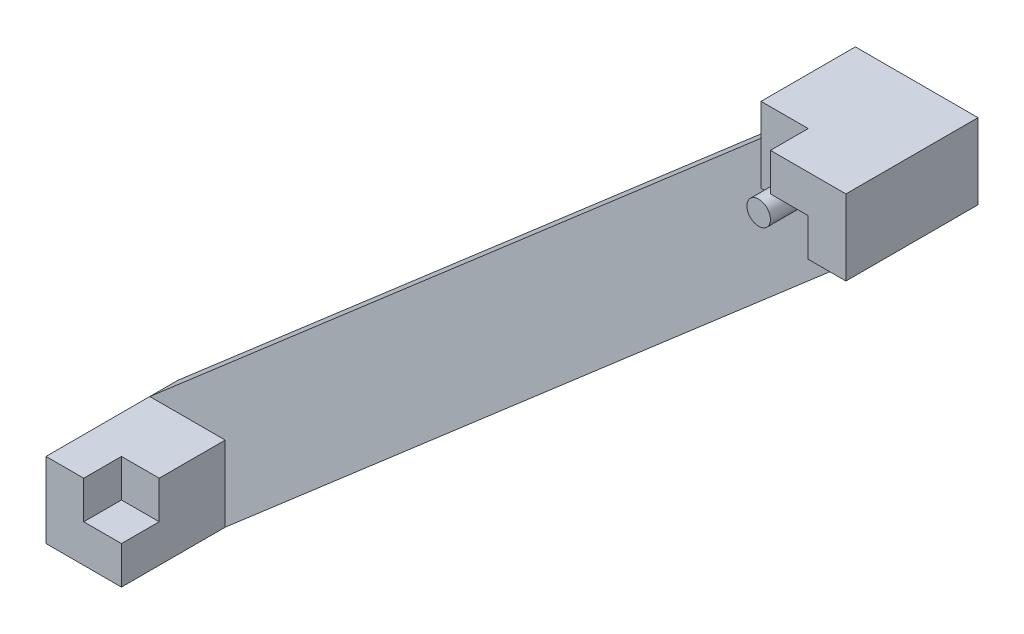
ISO-10303-21;
HEADER;
FILE_DESCRIPTION(('STEP AP214'),'2;1');
FILE_NAME('part.step','',(''),(''),'','','');
FILE_SCHEMA(('AUTOMOTIVE_DESIGN { 1 0 10303 214 1 1 1 1 }'));
ENDSEC;
DATA;
#1=APPLICATION_CONTEXT('core data for automotive mechanical design processes');
#2=APPLICATION_PROTOCOL_DEFINITION('international standard','automotive_design',2000,#1);
#3=PRODUCT_CONTEXT('',#1,'mechanical');
#4=PRODUCT('Part','Part','',(#3));
#5=PRODUCT_RELATED_PRODUCT_CATEGORY('part','',(#4));
#6=PRODUCT_DEFINITION_FORMATION('','',#4);
#7=PRODUCT_DEFINITION_CONTEXT('part definition',#1,'design');
#8=PRODUCT_DEFINITION('design','',#6,#7);
#9=PRODUCT_DEFINITION_SHAPE('','',#8);
#10=(LENGTH_UNIT() NAMED_UNIT(*) SI_UNIT(.MILLI.,.METRE.));
#11=(NAMED_UNIT(*) PLANE_ANGLE_UNIT() SI_UNIT($,.RADIAN.));
#12=(NAMED_UNIT(*) SI_UNIT($,.STERADIAN.) SOLID_ANGLE_UNIT());
#13=UNCERTAINTY_MEASURE_WITH_UNIT(LENGTH_MEASURE(1.E-05),#10,'distance_accuracy_value','');
#14=(GEOMETRIC_REPRESENTATION_CONTEXT(3) GLOBAL_UNCERTAINTY_ASSIGNED_CONTEXT((#13)) GLOBAL_UNIT_ASSIGNED_CONTEXT((#10,
#11,#12)) REPRESENTATION_CONTEXT('',''));
#15=CARTESIAN_POINT('',(0.,0.,0.));
#16=DIRECTION('',(0.,0.,1.));
#17=DIRECTION('',(1.,0.,0.));
#18=AXIS2_PLACEMENT_3D('',#15,#16,#17);
#19=CARTESIAN_POINT('',(71.55,64.15,4.));
#20=DIRECTION('',(0.,0.,-1.));
#21=DIRECTION('',(-1.,0.,0.));
#22=AXIS2_PLACEMENT_3D('',#19,#20,#21);
#23=CYLINDRICAL_SURFACE('',#22,1.25);
#24=CARTESIAN_POINT('',(71.55,64.15,4.));
#25=DIRECTION('',(0.,0.,1.));
#26=DIRECTION('',(1.,0.,0.));
#27=AXIS2_PLACEMENT_3D('',#24,#25,#26);
#28=CIRCLE('',#27,1.25);
#29=CARTESIAN_POINT('',(72.8,64.15,4.));
#30=VERTEX_POINT('',#29);
#31=EDGE_CURVE('E11',#30,#30,#28,.T.);
#32=ORIENTED_EDGE('',*,*,#31,.F.);
#33=EDGE_LOOP('',(#32));
#34=FACE_BOUND('',#33,.T.);
#35=CARTESIAN_POINT('',(71.55,64.15,0.));
#36=DIRECTION('',(0.,0.,1.));
#37=DIRECTION('',(1.,0.,0.));
#38=AXIS2_PLACEMENT_3D('',#35,#36,#37);
#39=CIRCLE('',#38,1.25);
#40=CARTESIAN_POINT('',(72.8,64.15,0.));
#41=VERTEX_POINT('',#40);
#42=EDGE_CURVE('E50',#41,#41,#39,.T.);
#43=ORIENTED_EDGE('',*,*,#42,.T.);
#44=EDGE_LOOP('',(#43));
#45=FACE_BOUND('',#44,.T.);
#46=ADVANCED_FACE('F47',(#34,#45),#23,.T.);
#47=CARTESIAN_POINT('',(71.55,64.15,4.));
#48=DIRECTION('',(0.,0.,1.));
#49=DIRECTION('',(1.,0.,0.));
#50=AXIS2_PLACEMENT_3D('',#47,#48,#49);
#51=PLANE('',#50);
#52=ORIENTED_EDGE('',*,*,#31,.T.);
#53=EDGE_LOOP('',(#52));
#54=FACE_BOUND('',#53,.T.);
#55=ADVANCED_FACE('F62',(#54),#51,.T.);
#56=CARTESIAN_POINT('',(71.55,64.15,0.));
#57=DIRECTION('',(0.,0.,1.));
#58=DIRECTION('',(1.,0.,0.));
#59=AXIS2_PLACEMENT_3D('',#56,#57,#58);
#60=PLANE('',#59);
#61=ORIENTED_EDGE('',*,*,#42,.F.);
#62=EDGE_LOOP('',(#61));
#63=FACE_BOUND('',#62,.T.);
#64=ADVANCED_FACE('F60',(#63),#60,.F.);
#65=CLOSED_SHELL('',(#46,#55,#64));
#66=MANIFOLD_SOLID_BREP('B2',#65);
#67=CARTESIAN_POINT('',(0.,0.,-7.));
#68=DIRECTION('',(0.,0.,-1.));
#69=DIRECTION('',(-1.,0.,0.));
#70=AXIS2_PLACEMENT_3D('',#67,#68,#69);
#71=PLANE('',#70);
#72=DIRECTION('',(-1.,0.,0.));
#73=VECTOR('',#72,1.);
#74=CARTESIAN_POINT('',(67.8,62.5,-7.));
#75=LINE('',#74,#73);
#76=CARTESIAN_POINT('',(80.8,62.5,-7.));
#77=VERTEX_POINT('',#76);
#78=CARTESIAN_POINT('',(67.8,62.5,-7.));
#79=VERTEX_POINT('',#78);
#80=EDGE_CURVE('E221',#77,#79,#75,.T.);
#81=ORIENTED_EDGE('',*,*,#80,.T.);
#82=DIRECTION('',(0.,1.,0.));
#83=VECTOR('',#82,1.);
#84=CARTESIAN_POINT('',(67.8,70.5,-7.));
#85=LINE('',#84,#83);
#86=CARTESIAN_POINT('',(67.8,66.1705729166667,-7.));
#87=VERTEX_POINT('',#86);
#88=EDGE_CURVE('E229',#79,#87,#85,.T.);
#89=ORIENTED_EDGE('',*,*,#88,.T.);
#90=DIRECTION('',(0.755981314702039,0.65459319567299,0.));
#91=VECTOR('',#90,1.);
#92=CARTESIAN_POINT('',(-4.,4.00000000000001,-7.));
#93=LINE('',#92,#91);
#94=CARTESIAN_POINT('',(-4.,4.00000000000001,-7.));
#95=VERTEX_POINT('',#94);
#96=EDGE_CURVE('E246',#95,#87,#93,.T.);
#97=ORIENTED_EDGE('',*,*,#96,.F.);
#98=DIRECTION('',(1.,0.,0.));
#99=VECTOR('',#98,1.);
#100=CARTESIAN_POINT('',(-4.,4.00000000000001,-7.));
#101=LINE('',#100,#99);
#102=CARTESIAN_POINT('',(4.00000000000001,4.00000000000001,-7.));
#103=VERTEX_POINT('',#102);
#104=EDGE_CURVE('E276',#95,#103,#101,.T.);
#105=ORIENTED_EDGE('',*,*,#104,.T.);
#106=DIRECTION('',(0.,-1.,0.));
#107=VECTOR('',#106,1.);
#108=CARTESIAN_POINT('',(4.00000000000001,-4.,-7.));
#109=LINE('',#108,#107);
#110=CARTESIAN_POINT('',(4.00000000000001,-4.,-7.));
#111=VERTEX_POINT('',#110);
#112=EDGE_CURVE('E245',#103,#111,#109,.T.);
#113=ORIENTED_EDGE('',*,*,#112,.T.);
#114=DIRECTION('',(-0.755981314702039,-0.65459319567299,0.));
#115=VECTOR('',#114,1.);
#116=CARTESIAN_POINT('',(4.00000000000001,-4.,-7.));
#117=LINE('',#116,#115);
#118=EDGE_CURVE('E236',#77,#111,#117,.T.);
#119=ORIENTED_EDGE('',*,*,#118,.F.);
#120=EDGE_LOOP('',(#81,#89,#97,#105,#113,#119));
#121=FACE_BOUND('',#120,.T.);
#122=ADVANCED_FACE('F88',(#121),#71,.F.);
#123=CARTESIAN_POINT('',(4.,0.,4.));
#124=DIRECTION('',(0.,-1.,0.));
#125=DIRECTION('',(0.,0.,-1.));
#126=AXIS2_PLACEMENT_3D('',#123,#124,#125);
#127=PLANE('',#126);
#128=DIRECTION('',(-1.,0.,0.));
#129=VECTOR('',#128,1.);
#130=CARTESIAN_POINT('',(4.,0.,0.));
#131=LINE('',#130,#129);
#132=CARTESIAN_POINT('',(4.00000000000001,0.,0.));
#133=VERTEX_POINT('',#132);
#134=CARTESIAN_POINT('',(0.,0.,0.));
#135=VERTEX_POINT('',#134);
#136=EDGE_CURVE('E278',#133,#135,#131,.T.);
#137=ORIENTED_EDGE('',*,*,#136,.T.);
#138=DIRECTION('',(0.,0.,-1.));
#139=VECTOR('',#138,1.);
#140=CARTESIAN_POINT('',(0.,0.,4.));
#141=LINE('',#140,#139);
#142=CARTESIAN_POINT('',(0.,0.,4.));
#143=VERTEX_POINT('',#142);
#144=EDGE_CURVE('E45',#143,#135,#141,.T.);
#145=ORIENTED_EDGE('',*,*,#144,.F.);
#146=DIRECTION('',(-1.,0.,0.));
#147=VECTOR('',#146,1.);
#148=CARTESIAN_POINT('',(4.,0.,4.));
#149=LINE('',#148,#147);
#150=CARTESIAN_POINT('',(4.,0.,4.));
#151=VERTEX_POINT('',#150);
#152=EDGE_CURVE('E281',#151,#143,#149,.T.);
#153=ORIENTED_EDGE('',*,*,#152,.F.);
#154=DIRECTION('',(0.,0.,-1.));
#155=VECTOR('',#154,1.);
#156=CARTESIAN_POINT('',(4.,0.,4.));
#157=LINE('',#156,#155);
#158=EDGE_CURVE('E293',#151,#133,#157,.T.);
#159=ORIENTED_EDGE('',*,*,#158,.T.);
#160=EDGE_LOOP('',(#137,#145,#153,#159));
#161=FACE_BOUND('',#160,.T.);
#162=ADVANCED_FACE('F90',(#161),#127,.F.);
#163=CARTESIAN_POINT('',(0.,0.,4.));
#164=DIRECTION('',(-1.,0.,0.));
#165=DIRECTION('',(0.,0.,1.));
#166=AXIS2_PLACEMENT_3D('',#163,#164,#165);
#167=PLANE('',#166);
#168=DIRECTION('',(0.,1.,0.));
#169=VECTOR('',#168,1.);
#170=CARTESIAN_POINT('',(0.,0.,0.));
#171=LINE('',#170,#169);
#172=CARTESIAN_POINT('',(0.,4.,0.));
#173=VERTEX_POINT('',#172);
#174=EDGE_CURVE('E284',#135,#173,#171,.T.);
#175=ORIENTED_EDGE('',*,*,#174,.T.);
#176=DIRECTION('',(0.,0.,-1.));
#177=VECTOR('',#176,1.);
#178=CARTESIAN_POINT('',(0.,4.,4.));
#179=LINE('',#178,#177);
#180=CARTESIAN_POINT('',(0.,4.,4.));
#181=VERTEX_POINT('',#180);
#182=EDGE_CURVE('E97',#181,#173,#179,.T.);
#183=ORIENTED_EDGE('',*,*,#182,.F.);
#184=DIRECTION('',(0.,1.,0.));
#185=VECTOR('',#184,1.);
#186=CARTESIAN_POINT('',(0.,0.,4.));
#187=LINE('',#186,#185);
#188=EDGE_CURVE('E283',#143,#181,#187,.T.);
#189=ORIENTED_EDGE('',*,*,#188,.F.);
#190=ORIENTED_EDGE('',*,*,#144,.T.);
#191=EDGE_LOOP('',(#175,#183,#189,#190));
#192=FACE_BOUND('',#191,.T.);
#193=ADVANCED_FACE('F313',(#192),#167,.F.);
#194=CARTESIAN_POINT('',(0.,4.,4.));
#195=DIRECTION('',(0.,-1.,0.));
#196=DIRECTION('',(1.,0.,0.));
#197=AXIS2_PLACEMENT_3D('',#194,#195,#196);
#198=PLANE('',#197);
#199=ORIENTED_EDGE('',*,*,#182,.T.);
#200=DIRECTION('',(1.,0.,0.));
#201=VECTOR('',#200,1.);
#202=CARTESIAN_POINT('',(-4.,4.00000000000001,0.));
#203=LINE('',#202,#201);
#204=CARTESIAN_POINT('',(4.00000000000001,4.00000000000001,0.));
#205=VERTEX_POINT('',#204);
#206=EDGE_CURVE('E275',#173,#205,#203,.T.);
#207=ORIENTED_EDGE('',*,*,#206,.T.);
#208=DIRECTION('',(0.,0.,1.));
#209=VECTOR('',#208,1.);
#210=CARTESIAN_POINT('',(4.00000000000001,4.00000000000001,-7.));
#211=LINE('',#210,#209);
#212=EDGE_CURVE('E269',#103,#205,#211,.T.);
#213=ORIENTED_EDGE('',*,*,#212,.F.);
#214=ORIENTED_EDGE('',*,*,#104,.F.);
#215=DIRECTION('',(0.,0.,-1.));
#216=VECTOR('',#215,1.);
#217=CARTESIAN_POINT('',(-4.,4.,4.));
#218=LINE('',#217,#216);
#219=CARTESIAN_POINT('',(-4.,4.,4.));
#220=VERTEX_POINT('',#219);
#221=EDGE_CURVE('E304',#220,#95,#218,.T.);
#222=ORIENTED_EDGE('',*,*,#221,.F.);
#223=DIRECTION('',(-1.,0.,0.));
#224=VECTOR('',#223,1.);
#225=CARTESIAN_POINT('',(0.,4.,4.));
#226=LINE('',#225,#224);
#227=EDGE_CURVE('E286',#181,#220,#226,.T.);
#228=ORIENTED_EDGE('',*,*,#227,.F.);
#229=EDGE_LOOP('',(#199,#207,#213,#214,#222,#228));
#230=FACE_BOUND('',#229,.T.);
#231=ADVANCED_FACE('F309',(#230),#198,.F.);
#232=CARTESIAN_POINT('',(-4.,4.,4.));
#233=DIRECTION('',(1.,0.,0.));
#234=DIRECTION('',(0.,1.,0.));
#235=AXIS2_PLACEMENT_3D('',#232,#233,#234);
#236=PLANE('',#235);
#237=ORIENTED_EDGE('',*,*,#221,.T.);
#238=DIRECTION('',(0.,0.,1.));
#239=VECTOR('',#238,1.);
#240=CARTESIAN_POINT('',(-4.,4.00000000000001,-10.));
#241=LINE('',#240,#239);
#242=CARTESIAN_POINT('',(-4.,4.00000000000001,-10.));
#243=VERTEX_POINT('',#242);
#244=EDGE_CURVE('E264',#243,#95,#241,.T.);
#245=ORIENTED_EDGE('',*,*,#244,.F.);
#246=DIRECTION('',(0.,1.,0.));
#247=VECTOR('',#246,1.);
#248=CARTESIAN_POINT('',(-4.,4.00000000000001,-10.));
#249=LINE('',#248,#247);
#250=CARTESIAN_POINT('',(-4.,-4.,-10.));
#251=VERTEX_POINT('',#250);
#252=EDGE_CURVE('E331',#251,#243,#249,.T.);
#253=ORIENTED_EDGE('',*,*,#252,.F.);
#254=DIRECTION('',(0.,0.,-1.));
#255=VECTOR('',#254,1.);
#256=CARTESIAN_POINT('',(-4.,-4.,4.));
#257=LINE('',#256,#255);
#258=CARTESIAN_POINT('',(-4.,-4.,4.));
#259=VERTEX_POINT('',#258);
#260=EDGE_CURVE('E302',#259,#251,#257,.T.);
#261=ORIENTED_EDGE('',*,*,#260,.F.);
#262=DIRECTION('',(0.,-1.,0.));
#263=VECTOR('',#262,1.);
#264=CARTESIAN_POINT('',(-4.,4.,4.));
#265=LINE('',#264,#263);
#266=EDGE_CURVE('E288',#220,#259,#265,.T.);
#267=ORIENTED_EDGE('',*,*,#266,.F.);
#268=EDGE_LOOP('',(#237,#245,#253,#261,#267));
#269=FACE_BOUND('',#268,.T.);
#270=ADVANCED_FACE('F328',(#269),#236,.F.);
#271=CARTESIAN_POINT('',(-4.,-4.,4.));
#272=DIRECTION('',(0.,1.,0.));
#273=DIRECTION('',(0.,0.,1.));
#274=AXIS2_PLACEMENT_3D('',#271,#272,#273);
#275=PLANE('',#274);
#276=ORIENTED_EDGE('',*,*,#260,.T.);
#277=DIRECTION('',(-1.,0.,0.));
#278=VECTOR('',#277,1.);
#279=CARTESIAN_POINT('',(-4.,-4.,-10.));
#280=LINE('',#279,#278);
#281=CARTESIAN_POINT('',(4.00000000000001,-4.,-10.));
#282=VERTEX_POINT('',#281);
#283=EDGE_CURVE('E351',#282,#251,#280,.T.);
#284=ORIENTED_EDGE('',*,*,#283,.F.);
#285=DIRECTION('',(0.,0.,1.));
#286=VECTOR('',#285,1.);
#287=CARTESIAN_POINT('',(4.00000000000001,-4.,-10.));
#288=LINE('',#287,#286);
#289=EDGE_CURVE('E240',#282,#111,#288,.T.);
#290=ORIENTED_EDGE('',*,*,#289,.T.);
#291=DIRECTION('',(0.,0.,-1.));
#292=VECTOR('',#291,1.);
#293=CARTESIAN_POINT('',(4.,-4.,4.));
#294=LINE('',#293,#292);
#295=CARTESIAN_POINT('',(4.,-4.,4.));
#296=VERTEX_POINT('',#295);
#297=EDGE_CURVE('E300',#296,#111,#294,.T.);
#298=ORIENTED_EDGE('',*,*,#297,.F.);
#299=DIRECTION('',(1.,0.,0.));
#300=VECTOR('',#299,1.);
#301=CARTESIAN_POINT('',(-4.,-4.,4.));
#302=LINE('',#301,#300);
#303=EDGE_CURVE('E290',#259,#296,#302,.T.);
#304=ORIENTED_EDGE('',*,*,#303,.F.);
#305=EDGE_LOOP('',(#276,#284,#290,#298,#304));
#306=FACE_BOUND('',#305,.T.);
#307=ADVANCED_FACE('F336',(#306),#275,.F.);
#308=CARTESIAN_POINT('',(4.,-4.,4.));
#309=DIRECTION('',(-1.,0.,0.));
#310=DIRECTION('',(0.,0.,1.));
#311=AXIS2_PLACEMENT_3D('',#308,#309,#310);
#312=PLANE('',#311);
#313=ORIENTED_EDGE('',*,*,#297,.T.);
#314=ORIENTED_EDGE('',*,*,#112,.F.);
#315=ORIENTED_EDGE('',*,*,#212,.T.);
#316=DIRECTION('',(0.,-1.,0.));
#317=VECTOR('',#316,1.);
#318=CARTESIAN_POINT('',(4.00000000000001,-4.,0.));
#319=LINE('',#318,#317);
#320=EDGE_CURVE('E272',#205,#133,#319,.T.);
#321=ORIENTED_EDGE('',*,*,#320,.T.);
#322=ORIENTED_EDGE('',*,*,#158,.F.);
#323=DIRECTION('',(0.,1.,0.));
#324=VECTOR('',#323,1.);
#325=CARTESIAN_POINT('',(4.,-4.,4.));
#326=LINE('',#325,#324);
#327=EDGE_CURVE('E104',#296,#151,#326,.T.);
#328=ORIENTED_EDGE('',*,*,#327,.F.);
#329=EDGE_LOOP('',(#313,#314,#315,#321,#322,#328));
#330=FACE_BOUND('',#329,.T.);
#331=ADVANCED_FACE('F319',(#330),#312,.F.);
#332=CARTESIAN_POINT('',(0.,0.,4.));
#333=DIRECTION('',(0.,0.,-1.));
#334=DIRECTION('',(-1.,0.,0.));
#335=AXIS2_PLACEMENT_3D('',#332,#333,#334);
#336=PLANE('',#335);
#337=ORIENTED_EDGE('',*,*,#152,.T.);
#338=ORIENTED_EDGE('',*,*,#188,.T.);
#339=ORIENTED_EDGE('',*,*,#227,.T.);
#340=ORIENTED_EDGE('',*,*,#266,.T.);
#341=ORIENTED_EDGE('',*,*,#303,.T.);
#342=ORIENTED_EDGE('',*,*,#327,.T.);
#343=EDGE_LOOP('',(#337,#338,#339,#340,#341,#342));
#344=FACE_BOUND('',#343,.T.);
#345=ADVANCED_FACE('F322',(#344),#336,.F.);
#346=CARTESIAN_POINT('',(0.,0.,0.));
#347=DIRECTION('',(0.,0.,-1.));
#348=DIRECTION('',(-1.,0.,0.));
#349=AXIS2_PLACEMENT_3D('',#346,#347,#348);
#350=PLANE('',#349);
#351=ORIENTED_EDGE('',*,*,#136,.F.);
#352=ORIENTED_EDGE('',*,*,#320,.F.);
#353=ORIENTED_EDGE('',*,*,#206,.F.);
#354=ORIENTED_EDGE('',*,*,#174,.F.);
#355=EDGE_LOOP('',(#351,#352,#353,#354));
#356=FACE_BOUND('',#355,.T.);
#357=ADVANCED_FACE('F316',(#356),#350,.F.);
#358=CARTESIAN_POINT('',(80.8,70.5,-10.));
#359=DIRECTION('',(0.,-1.,0.));
#360=DIRECTION('',(0.,0.,-1.));
#361=AXIS2_PLACEMENT_3D('',#358,#359,#360);
#362=PLANE('',#361);
#363=DIRECTION('',(0.,0.,1.));
#364=VECTOR('',#363,1.);
#365=CARTESIAN_POINT('',(67.8,70.5,-10.));
#366=LINE('',#365,#364);
#367=CARTESIAN_POINT('',(67.8,70.5,-10.));
#368=VERTEX_POINT('',#367);
#369=CARTESIAN_POINT('',(67.8,70.5,0.));
#370=VERTEX_POINT('',#369);
#371=EDGE_CURVE('E259',#368,#370,#366,.T.);
#372=ORIENTED_EDGE('',*,*,#371,.T.);
#373=DIRECTION('',(1.,0.,0.));
#374=VECTOR('',#373,1.);
#375=CARTESIAN_POINT('',(80.8,70.5,0.));
#376=LINE('',#375,#374);
#377=CARTESIAN_POINT('',(72.8,70.5,0.));
#378=VERTEX_POINT('',#377);
#379=EDGE_CURVE('E230',#370,#378,#376,.T.);
#380=ORIENTED_EDGE('',*,*,#379,.T.);
#381=DIRECTION('',(0.,0.,-1.));
#382=VECTOR('',#381,1.);
#383=CARTESIAN_POINT('',(72.8,70.5,4.));
#384=LINE('',#383,#382);
#385=CARTESIAN_POINT('',(72.8,70.5,4.));
#386=VERTEX_POINT('',#385);
#387=EDGE_CURVE('E217',#386,#378,#384,.T.);
#388=ORIENTED_EDGE('',*,*,#387,.F.);
#389=DIRECTION('',(-1.,0.,0.));
#390=VECTOR('',#389,1.);
#391=CARTESIAN_POINT('',(80.8,70.5,4.));
#392=LINE('',#391,#390);
#393=CARTESIAN_POINT('',(80.8,70.5,4.));
#394=VERTEX_POINT('',#393);
#395=EDGE_CURVE('E368',#394,#386,#392,.T.);
#396=ORIENTED_EDGE('',*,*,#395,.F.);
#397=DIRECTION('',(0.,0.,1.));
#398=VECTOR('',#397,1.);
#399=CARTESIAN_POINT('',(80.8,70.5,-10.));
#400=LINE('',#399,#398);
#401=CARTESIAN_POINT('',(80.8,70.5,-10.));
#402=VERTEX_POINT('',#401);
#403=EDGE_CURVE('E239',#402,#394,#400,.T.);
#404=ORIENTED_EDGE('',*,*,#403,.F.);
#405=DIRECTION('',(1.,0.,0.));
#406=VECTOR('',#405,1.);
#407=CARTESIAN_POINT('',(80.8,70.5,-10.));
#408=LINE('',#407,#406);
#409=EDGE_CURVE('E250',#368,#402,#408,.T.);
#410=ORIENTED_EDGE('',*,*,#409,.F.);
#411=EDGE_LOOP('',(#372,#380,#388,#396,#404,#410));
#412=FACE_BOUND('',#411,.T.);
#413=ADVANCED_FACE('F399',(#412),#362,.F.);
#414=CARTESIAN_POINT('',(80.8,62.5,-10.));
#415=DIRECTION('',(-1.,0.,0.));
#416=DIRECTION('',(0.,0.,1.));
#417=AXIS2_PLACEMENT_3D('',#414,#415,#416);
#418=PLANE('',#417);
#419=ORIENTED_EDGE('',*,*,#403,.T.);
#420=DIRECTION('',(0.,1.,0.));
#421=VECTOR('',#420,1.);
#422=CARTESIAN_POINT('',(80.8,62.5,4.));
#423=LINE('',#422,#421);
#424=CARTESIAN_POINT('',(80.8,62.5,4.));
#425=VERTEX_POINT('',#424);
#426=EDGE_CURVE('E214',#425,#394,#423,.T.);
#427=ORIENTED_EDGE('',*,*,#426,.F.);
#428=DIRECTION('',(0.,0.,-1.));
#429=VECTOR('',#428,1.);
#430=CARTESIAN_POINT('',(80.8,62.5,4.));
#431=LINE('',#430,#429);
#432=EDGE_CURVE('E207',#425,#77,#431,.T.);
#433=ORIENTED_EDGE('',*,*,#432,.T.);
#434=DIRECTION('',(0.,0.,1.));
#435=VECTOR('',#434,1.);
#436=CARTESIAN_POINT('',(80.8,62.5,-10.));
#437=LINE('',#436,#435);
#438=CARTESIAN_POINT('',(80.8,62.5,-10.));
#439=VERTEX_POINT('',#438);
#440=EDGE_CURVE('E211',#439,#77,#437,.T.);
#441=ORIENTED_EDGE('',*,*,#440,.F.);
#442=DIRECTION('',(0.,-1.,0.));
#443=VECTOR('',#442,1.);
#444=CARTESIAN_POINT('',(80.8,62.5,-10.));
#445=LINE('',#444,#443);
#446=EDGE_CURVE('E356',#402,#439,#445,.T.);
#447=ORIENTED_EDGE('',*,*,#446,.F.);
#448=EDGE_LOOP('',(#419,#427,#433,#441,#447));
#449=FACE_BOUND('',#448,.T.);
#450=ADVANCED_FACE('F209',(#449),#418,.F.);
#451=CARTESIAN_POINT('',(4.00000000000001,-4.,-10.));
#452=DIRECTION('',(-0.654593195672989,0.755981314702039,0.));
#453=DIRECTION('',(-0.755981314702039,-0.65459319567299,0.));
#454=AXIS2_PLACEMENT_3D('',#451,#452,#453);
#455=PLANE('',#454);
#456=ORIENTED_EDGE('',*,*,#118,.T.);
#457=ORIENTED_EDGE('',*,*,#289,.F.);
#458=DIRECTION('',(-0.755981314702039,-0.65459319567299,0.));
#459=VECTOR('',#458,1.);
#460=CARTESIAN_POINT('',(4.00000000000001,-4.,-10.));
#461=LINE('',#460,#459);
#462=EDGE_CURVE('E238',#439,#282,#461,.T.);
#463=ORIENTED_EDGE('',*,*,#462,.F.);
#464=ORIENTED_EDGE('',*,*,#440,.T.);
#465=EDGE_LOOP('',(#456,#457,#463,#464));
#466=FACE_BOUND('',#465,.T.);
#467=ADVANCED_FACE('F234',(#466),#455,.F.);
#468=CARTESIAN_POINT('',(-4.,4.00000000000001,-10.));
#469=DIRECTION('',(0.65459319567299,-0.755981314702039,0.));
#470=DIRECTION('',(0.755981314702039,0.65459319567299,0.));
#471=AXIS2_PLACEMENT_3D('',#468,#469,#470);
#472=PLANE('',#471);
#473=ORIENTED_EDGE('',*,*,#96,.T.);
#474=DIRECTION('',(0.,0.,1.));
#475=VECTOR('',#474,1.);
#476=CARTESIAN_POINT('',(67.8,66.1705729166667,-10.));
#477=LINE('',#476,#475);
#478=CARTESIAN_POINT('',(67.8,66.1705729166667,-10.));
#479=VERTEX_POINT('',#478);
#480=EDGE_CURVE('E261',#479,#87,#477,.T.);
#481=ORIENTED_EDGE('',*,*,#480,.F.);
#482=DIRECTION('',(0.755981314702039,0.65459319567299,0.));
#483=VECTOR('',#482,1.);
#484=CARTESIAN_POINT('',(-4.,4.00000000000001,-10.));
#485=LINE('',#484,#483);
#486=EDGE_CURVE('E350',#243,#479,#485,.T.);
#487=ORIENTED_EDGE('',*,*,#486,.F.);
#488=ORIENTED_EDGE('',*,*,#244,.T.);
#489=EDGE_LOOP('',(#473,#481,#487,#488));
#490=FACE_BOUND('',#489,.T.);
#491=ADVANCED_FACE('F340',(#490),#472,.F.);
#492=CARTESIAN_POINT('',(67.8,66.1705729166667,-10.));
#493=DIRECTION('',(1.,0.,0.));
#494=DIRECTION('',(0.,0.,-1.));
#495=AXIS2_PLACEMENT_3D('',#492,#493,#494);
#496=PLANE('',#495);
#497=ORIENTED_EDGE('',*,*,#480,.T.);
#498=ORIENTED_EDGE('',*,*,#88,.F.);
#499=DIRECTION('',(0.,0.,1.));
#500=VECTOR('',#499,1.);
#501=CARTESIAN_POINT('',(67.8,62.5,-7.));
#502=LINE('',#501,#500);
#503=CARTESIAN_POINT('',(67.8,62.5,0.));
#504=VERTEX_POINT('',#503);
#505=EDGE_CURVE('E225',#79,#504,#502,.T.);
#506=ORIENTED_EDGE('',*,*,#505,.T.);
#507=DIRECTION('',(0.,1.,0.));
#508=VECTOR('',#507,1.);
#509=CARTESIAN_POINT('',(67.8,70.5,0.));
#510=LINE('',#509,#508);
#511=EDGE_CURVE('E388',#504,#370,#510,.T.);
#512=ORIENTED_EDGE('',*,*,#511,.T.);
#513=ORIENTED_EDGE('',*,*,#371,.F.);
#514=DIRECTION('',(0.,1.,0.));
#515=VECTOR('',#514,1.);
#516=CARTESIAN_POINT('',(67.8,66.1705729166667,-10.));
#517=LINE('',#516,#515);
#518=EDGE_CURVE('E256',#479,#368,#517,.T.);
#519=ORIENTED_EDGE('',*,*,#518,.F.);
#520=EDGE_LOOP('',(#497,#498,#506,#512,#513,#519));
#521=FACE_BOUND('',#520,.T.);
#522=ADVANCED_FACE('F344',(#521),#496,.F.);
#523=CARTESIAN_POINT('',(0.,0.,-10.));
#524=DIRECTION('',(0.,0.,-1.));
#525=DIRECTION('',(-1.,0.,0.));
#526=AXIS2_PLACEMENT_3D('',#523,#524,#525);
#527=PLANE('',#526);
#528=ORIENTED_EDGE('',*,*,#409,.T.);
#529=ORIENTED_EDGE('',*,*,#446,.T.);
#530=ORIENTED_EDGE('',*,*,#462,.T.);
#531=ORIENTED_EDGE('',*,*,#283,.T.);
#532=ORIENTED_EDGE('',*,*,#252,.T.);
#533=ORIENTED_EDGE('',*,*,#486,.T.);
#534=ORIENTED_EDGE('',*,*,#518,.T.);
#535=EDGE_LOOP('',(#528,#529,#530,#531,#532,#533,#534));
#536=FACE_BOUND('',#535,.T.);
#537=ADVANCED_FACE('F410',(#536),#527,.T.);
#538=CARTESIAN_POINT('',(72.8,66.5,4.));
#539=DIRECTION('',(0.,1.,0.));
#540=DIRECTION('',(0.,0.,1.));
#541=AXIS2_PLACEMENT_3D('',#538,#539,#540);
#542=PLANE('',#541);
#543=DIRECTION('',(1.,0.,0.));
#544=VECTOR('',#543,1.);
#545=CARTESIAN_POINT('',(72.8,66.5,0.));
#546=LINE('',#545,#544);
#547=CARTESIAN_POINT('',(72.8,66.5,0.));
#548=VERTEX_POINT('',#547);
#549=CARTESIAN_POINT('',(76.8,66.5,0.));
#550=VERTEX_POINT('',#549);
#551=EDGE_CURVE('E247',#548,#550,#546,.T.);
#552=ORIENTED_EDGE('',*,*,#551,.T.);
#553=DIRECTION('',(0.,0.,-1.));
#554=VECTOR('',#553,1.);
#555=CARTESIAN_POINT('',(76.8,66.5,4.));
#556=LINE('',#555,#554);
#557=CARTESIAN_POINT('',(76.8,66.5,4.));
#558=VERTEX_POINT('',#557);
#559=EDGE_CURVE('E382',#558,#550,#556,.T.);
#560=ORIENTED_EDGE('',*,*,#559,.F.);
#561=DIRECTION('',(1.,0.,0.));
#562=VECTOR('',#561,1.);
#563=CARTESIAN_POINT('',(72.8,66.5,4.));
#564=LINE('',#563,#562);
#565=CARTESIAN_POINT('',(72.8,66.5,4.));
#566=VERTEX_POINT('',#565);
#567=EDGE_CURVE('E359',#566,#558,#564,.T.);
#568=ORIENTED_EDGE('',*,*,#567,.F.);
#569=DIRECTION('',(0.,0.,-1.));
#570=VECTOR('',#569,1.);
#571=CARTESIAN_POINT('',(72.8,66.5,4.));
#572=LINE('',#571,#570);
#573=EDGE_CURVE('E371',#566,#548,#572,.T.);
#574=ORIENTED_EDGE('',*,*,#573,.T.);
#575=EDGE_LOOP('',(#552,#560,#568,#574));
#576=FACE_BOUND('',#575,.T.);
#577=ADVANCED_FACE('F412',(#576),#542,.F.);
#578=CARTESIAN_POINT('',(76.8,66.5,4.));
#579=DIRECTION('',(1.,0.,0.));
#580=DIRECTION('',(0.,0.,-1.));
#581=AXIS2_PLACEMENT_3D('',#578,#579,#580);
#582=PLANE('',#581);
#583=DIRECTION('',(0.,-1.,0.));
#584=VECTOR('',#583,1.);
#585=CARTESIAN_POINT('',(76.8,66.5,0.));
#586=LINE('',#585,#584);
#587=CARTESIAN_POINT('',(76.8,62.5,0.));
#588=VERTEX_POINT('',#587);
#589=EDGE_CURVE('E253',#550,#588,#586,.T.);
#590=ORIENTED_EDGE('',*,*,#589,.T.);
#591=DIRECTION('',(0.,0.,-1.));
#592=VECTOR('',#591,1.);
#593=CARTESIAN_POINT('',(76.8,62.5,4.));
#594=LINE('',#593,#592);
#595=CARTESIAN_POINT('',(76.8,62.5,4.));
#596=VERTEX_POINT('',#595);
#597=EDGE_CURVE('E218',#596,#588,#594,.T.);
#598=ORIENTED_EDGE('',*,*,#597,.F.);
#599=DIRECTION('',(0.,-1.,0.));
#600=VECTOR('',#599,1.);
#601=CARTESIAN_POINT('',(76.8,66.5,4.));
#602=LINE('',#601,#600);
#603=EDGE_CURVE('E363',#558,#596,#602,.T.);
#604=ORIENTED_EDGE('',*,*,#603,.F.);
#605=ORIENTED_EDGE('',*,*,#559,.T.);
#606=EDGE_LOOP('',(#590,#598,#604,#605));
#607=FACE_BOUND('',#606,.T.);
#608=ADVANCED_FACE('F418',(#607),#582,.F.);
#609=CARTESIAN_POINT('',(76.8,62.5,4.));
#610=DIRECTION('',(0.,1.,0.));
#611=DIRECTION('',(0.,0.,1.));
#612=AXIS2_PLACEMENT_3D('',#609,#610,#611);
#613=PLANE('',#612);
#614=ORIENTED_EDGE('',*,*,#597,.T.);
#615=DIRECTION('',(-1.,0.,0.));
#616=VECTOR('',#615,1.);
#617=CARTESIAN_POINT('',(67.8,62.5,0.));
#618=LINE('',#617,#616);
#619=EDGE_CURVE('E390',#588,#504,#618,.T.);
#620=ORIENTED_EDGE('',*,*,#619,.T.);
#621=ORIENTED_EDGE('',*,*,#505,.F.);
#622=ORIENTED_EDGE('',*,*,#80,.F.);
#623=ORIENTED_EDGE('',*,*,#432,.F.);
#624=DIRECTION('',(1.,0.,0.));
#625=VECTOR('',#624,1.);
#626=CARTESIAN_POINT('',(76.8,62.5,4.));
#627=LINE('',#626,#625);
#628=EDGE_CURVE('E365',#596,#425,#627,.T.);
#629=ORIENTED_EDGE('',*,*,#628,.F.);
#630=EDGE_LOOP('',(#614,#620,#621,#622,#623,#629));
#631=FACE_BOUND('',#630,.T.);
#632=ADVANCED_FACE('F223',(#631),#613,.F.);
#633=CARTESIAN_POINT('',(72.8,70.5,4.));
#634=DIRECTION('',(1.,0.,0.));
#635=DIRECTION('',(0.,0.,-1.));
#636=AXIS2_PLACEMENT_3D('',#633,#634,#635);
#637=PLANE('',#636);
#638=DIRECTION('',(0.,-1.,0.));
#639=VECTOR('',#638,1.);
#640=CARTESIAN_POINT('',(72.8,70.5,0.));
#641=LINE('',#640,#639);
#642=EDGE_CURVE('E362',#378,#548,#641,.T.);
#643=ORIENTED_EDGE('',*,*,#642,.T.);
#644=ORIENTED_EDGE('',*,*,#573,.F.);
#645=DIRECTION('',(0.,-1.,0.));
#646=VECTOR('',#645,1.);
#647=CARTESIAN_POINT('',(72.8,70.5,4.));
#648=LINE('',#647,#646);
#649=EDGE_CURVE('E370',#386,#566,#648,.T.);
#650=ORIENTED_EDGE('',*,*,#649,.F.);
#651=ORIENTED_EDGE('',*,*,#387,.T.);
#652=EDGE_LOOP('',(#643,#644,#650,#651));
#653=FACE_BOUND('',#652,.T.);
#654=ADVANCED_FACE('F403',(#653),#637,.F.);
#655=CARTESIAN_POINT('',(0.,0.,4.));
#656=DIRECTION('',(0.,0.,-1.));
#657=DIRECTION('',(-1.,0.,0.));
#658=AXIS2_PLACEMENT_3D('',#655,#656,#657);
#659=PLANE('',#658);
#660=ORIENTED_EDGE('',*,*,#567,.T.);
#661=ORIENTED_EDGE('',*,*,#603,.T.);
#662=ORIENTED_EDGE('',*,*,#628,.T.);
#663=ORIENTED_EDGE('',*,*,#426,.T.);
#664=ORIENTED_EDGE('',*,*,#395,.T.);
#665=ORIENTED_EDGE('',*,*,#649,.T.);
#666=EDGE_LOOP('',(#660,#661,#662,#663,#664,#665));
#667=FACE_BOUND('',#666,.T.);
#668=ADVANCED_FACE('F407',(#667),#659,.F.);
#669=CARTESIAN_POINT('',(0.,0.,0.));
#670=DIRECTION('',(0.,0.,1.));
#671=DIRECTION('',(1.,0.,0.));
#672=AXIS2_PLACEMENT_3D('',#669,#670,#671);
#673=PLANE('',#672);
#674=ORIENTED_EDGE('',*,*,#642,.F.);
#675=ORIENTED_EDGE('',*,*,#379,.F.);
#676=ORIENTED_EDGE('',*,*,#511,.F.);
#677=ORIENTED_EDGE('',*,*,#619,.F.);
#678=ORIENTED_EDGE('',*,*,#589,.F.);
#679=ORIENTED_EDGE('',*,*,#551,.F.);
#680=EDGE_LOOP('',(#674,#675,#676,#677,#678,#679));
#681=FACE_BOUND('',#680,.T.);
#682=ADVANCED_FACE('F396',(#681),#673,.T.);
#683=CLOSED_SHELL('',(#122,#162,#193,#231,#270,#307,#331,#345,#357,#413,#450,#467,#491,#522,
#537,#577,#608,#632,#654,#668,#682));
#684=MANIFOLD_SOLID_BREP('B6',#683);
#685=ADVANCED_BREP_SHAPE_REPRESENTATION('',(#18,#66,#684),#14);
#686=SHAPE_DEFINITION_REPRESENTATION(#9,#685);
ENDSEC;
END-ISO-10303-21;
